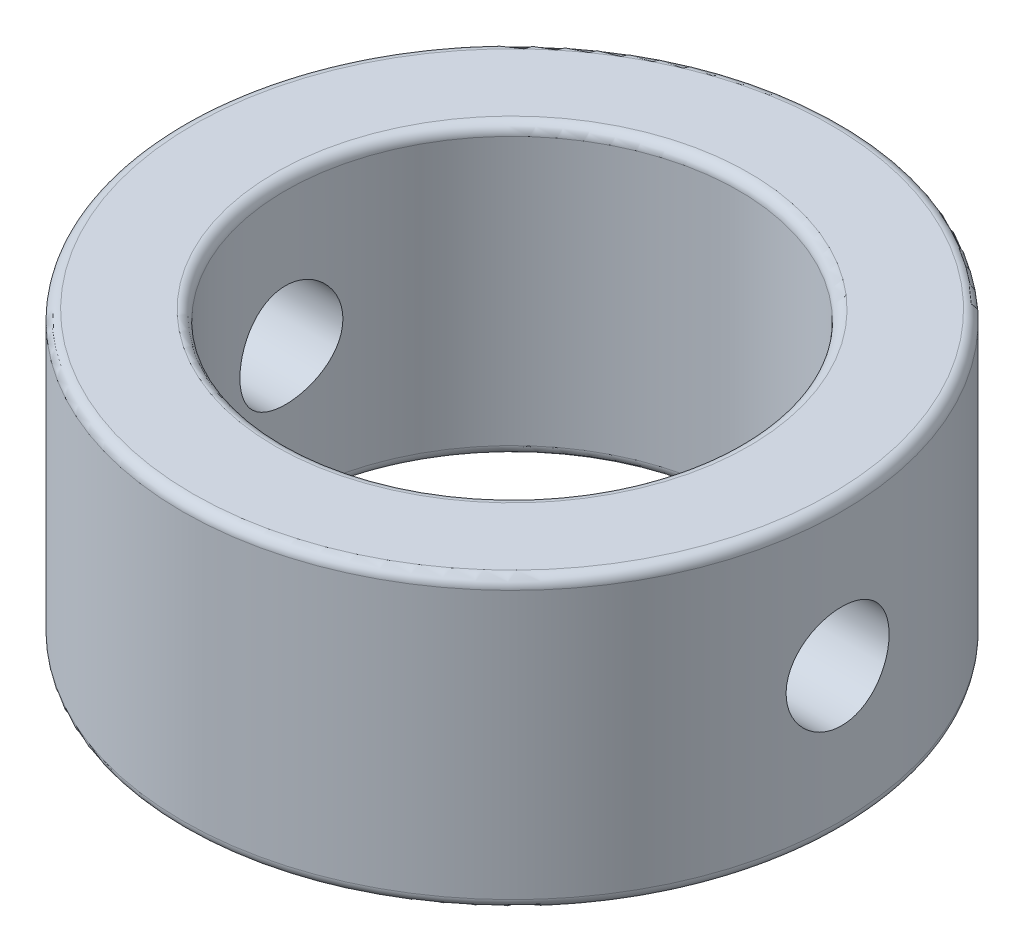
ISO-10303-21;
HEADER;
FILE_DESCRIPTION(('STEP AP214'),'2;1');
FILE_NAME('part.step','',(''),(''),'','','');
FILE_SCHEMA(('AUTOMOTIVE_DESIGN { 1 0 10303 214 1 1 1 1 }'));
ENDSEC;
DATA;
#1=APPLICATION_CONTEXT('core data for automotive mechanical design processes');
#2=APPLICATION_PROTOCOL_DEFINITION('international standard','automotive_design',2000,#1);
#3=PRODUCT_CONTEXT('',#1,'mechanical');
#4=PRODUCT('Part','Part','',(#3));
#5=PRODUCT_RELATED_PRODUCT_CATEGORY('part','',(#4));
#6=PRODUCT_DEFINITION_FORMATION('','',#4);
#7=PRODUCT_DEFINITION_CONTEXT('part definition',#1,'design');
#8=PRODUCT_DEFINITION('design','',#6,#7);
#9=PRODUCT_DEFINITION_SHAPE('','',#8);
#10=(LENGTH_UNIT() NAMED_UNIT(*) SI_UNIT(.MILLI.,.METRE.));
#11=(NAMED_UNIT(*) PLANE_ANGLE_UNIT() SI_UNIT($,.RADIAN.));
#12=(NAMED_UNIT(*) SI_UNIT($,.STERADIAN.) SOLID_ANGLE_UNIT());
#13=UNCERTAINTY_MEASURE_WITH_UNIT(LENGTH_MEASURE(1.E-05),#10,'distance_accuracy_value','');
#14=(GEOMETRIC_REPRESENTATION_CONTEXT(3) GLOBAL_UNCERTAINTY_ASSIGNED_CONTEXT((#13)) GLOBAL_UNIT_ASSIGNED_CONTEXT((#10,
#11,#12)) REPRESENTATION_CONTEXT('',''));
#15=CARTESIAN_POINT('',(0.,0.,0.));
#16=DIRECTION('',(0.,0.,1.));
#17=DIRECTION('',(1.,0.,0.));
#18=AXIS2_PLACEMENT_3D('',#15,#16,#17);
#19=CARTESIAN_POINT('',(0.,7.,0.));
#20=DIRECTION('',(0.,1.,0.));
#21=DIRECTION('',(0.,0.,1.));
#22=AXIS2_PLACEMENT_3D('',#19,#20,#21);
#23=PLANE('',#22);
#24=CARTESIAN_POINT('',(0.,7.,0.));
#25=DIRECTION('',(0.,1.,0.));
#26=DIRECTION('',(0.,0.,1.));
#27=AXIS2_PLACEMENT_3D('',#24,#25,#26);
#28=CIRCLE('',#27,11.5);
#29=CARTESIAN_POINT('',(0.,7.,11.5));
#30=VERTEX_POINT('',#29);
#31=EDGE_CURVE('E10',#30,#30,#28,.F.);
#32=ORIENTED_EDGE('',*,*,#31,.T.);
#33=EDGE_LOOP('',(#32));
#34=FACE_BOUND('',#33,.T.);
#35=CARTESIAN_POINT('',(0.,7.,0.));
#36=DIRECTION('',(0.,1.,0.));
#37=DIRECTION('',(0.,0.,1.));
#38=AXIS2_PLACEMENT_3D('',#35,#36,#37);
#39=CIRCLE('',#38,15.5);
#40=CARTESIAN_POINT('',(0.,7.,15.5));
#41=VERTEX_POINT('',#40);
#42=EDGE_CURVE('E44',#41,#41,#39,.T.);
#43=ORIENTED_EDGE('',*,*,#42,.T.);
#44=EDGE_LOOP('',(#43));
#45=FACE_BOUND('',#44,.T.);
#46=ADVANCED_FACE('F37',(#34,#45),#23,.T.);
#47=CARTESIAN_POINT('',(0.,-7.,0.));
#48=DIRECTION('',(0.,1.,0.));
#49=DIRECTION('',(0.,0.,1.));
#50=AXIS2_PLACEMENT_3D('',#47,#48,#49);
#51=PLANE('',#50);
#52=CARTESIAN_POINT('',(0.,-7.,0.));
#53=DIRECTION('',(0.,1.,0.));
#54=DIRECTION('',(0.,0.,1.));
#55=AXIS2_PLACEMENT_3D('',#52,#53,#54);
#56=CIRCLE('',#55,11.5);
#57=CARTESIAN_POINT('',(0.,-7.,11.5));
#58=VERTEX_POINT('',#57);
#59=EDGE_CURVE('E63',#58,#58,#56,.T.);
#60=ORIENTED_EDGE('',*,*,#59,.T.);
#61=EDGE_LOOP('',(#60));
#62=FACE_BOUND('',#61,.T.);
#63=CARTESIAN_POINT('',(0.,-7.,0.));
#64=DIRECTION('',(0.,1.,0.));
#65=DIRECTION('',(0.,0.,1.));
#66=AXIS2_PLACEMENT_3D('',#63,#64,#65);
#67=CIRCLE('',#66,15.5);
#68=CARTESIAN_POINT('',(0.,-7.,15.5));
#69=VERTEX_POINT('',#68);
#70=EDGE_CURVE('E66',#69,#69,#67,.F.);
#71=ORIENTED_EDGE('',*,*,#70,.T.);
#72=EDGE_LOOP('',(#71));
#73=FACE_BOUND('',#72,.T.);
#74=ADVANCED_FACE('F110',(#62,#73),#51,.F.);
#75=CARTESIAN_POINT('',(0.,7.,0.));
#76=DIRECTION('',(0.,-1.,0.));
#77=DIRECTION('',(0.,0.,-1.));
#78=AXIS2_PLACEMENT_3D('',#75,#76,#77);
#79=CYLINDRICAL_SURFACE('',#78,16.);
#80=CARTESIAN_POINT('',(0.,-6.5,0.));
#81=DIRECTION('',(0.,1.,0.));
#82=DIRECTION('',(0.,0.,1.));
#83=AXIS2_PLACEMENT_3D('',#80,#81,#82);
#84=CIRCLE('',#83,16.);
#85=CARTESIAN_POINT('',(0.,-6.5,16.));
#86=VERTEX_POINT('',#85);
#87=EDGE_CURVE('E48',#86,#86,#84,.T.);
#88=ORIENTED_EDGE('',*,*,#87,.T.);
#89=EDGE_LOOP('',(#88));
#90=FACE_BOUND('',#89,.T.);
#91=CARTESIAN_POINT('',(0.,6.5,0.));
#92=DIRECTION('',(0.,1.,0.));
#93=DIRECTION('',(0.,0.,1.));
#94=AXIS2_PLACEMENT_3D('',#91,#92,#93);
#95=CIRCLE('',#94,16.);
#96=CARTESIAN_POINT('',(0.,6.5,16.));
#97=VERTEX_POINT('',#96);
#98=EDGE_CURVE('E52',#97,#97,#95,.F.);
#99=ORIENTED_EDGE('',*,*,#98,.T.);
#100=EDGE_LOOP('',(#99));
#101=FACE_BOUND('',#100,.T.);
#102=CARTESIAN_POINT('',(-16.,-2.5,0.));
#103=CARTESIAN_POINT('',(-15.9999977019448,-2.49999430172848,-0.139515097271033));
#104=CARTESIAN_POINT('',(-15.9981561248574,-2.48828188622644,-0.279109404865704));
#105=CARTESIAN_POINT('',(-15.9909869809759,-2.44175630872324,-0.554391314978102));
#106=CARTESIAN_POINT('',(-15.9856560884472,-2.40692110749649,-0.690075061323317));
#107=CARTESIAN_POINT('',(-15.9721069716578,-2.31522033719338,-0.953512538047404));
#108=CARTESIAN_POINT('',(-15.9638909956317,-2.2583719186384,-1.0812723522899));
#109=CARTESIAN_POINT('',(-15.9454779403815,-2.12430145485839,-1.3254212510446));
#110=CARTESIAN_POINT('',(-15.9352811186255,-2.04708205696406,-1.44181181036831));
#111=CARTESIAN_POINT('',(-15.9139426841436,-1.87376695164604,-1.66091991165162));
#112=CARTESIAN_POINT('',(-15.9027945139234,-1.77753300510975,-1.76352747914264));
#113=CARTESIAN_POINT('',(-15.8808607613029,-1.56921805173111,-1.95120768822823));
#114=CARTESIAN_POINT('',(-15.8700752005075,-1.4571361026998,-2.03627928654192));
#115=CARTESIAN_POINT('',(-15.8500242812745,-1.21956172865627,-2.18690544328884));
#116=CARTESIAN_POINT('',(-15.840767397861,-1.09400051763821,-2.25235273557992));
#117=CARTESIAN_POINT('',(-15.8249120174236,-0.833498589142195,-2.36118681597065));
#118=CARTESIAN_POINT('',(-15.8183133630222,-0.69855842748944,-2.40457491010063));
#119=CARTESIAN_POINT('',(-15.8085863451104,-0.424289098856214,-2.46771559322167));
#120=CARTESIAN_POINT('',(-15.8054302653236,-0.285004414181201,-2.48765705487496));
#121=CARTESIAN_POINT('',(-15.8028617107177,-0.00503281110735576,-2.50392369757621));
#122=CARTESIAN_POINT('',(-15.8034490028802,0.13565401946604,-2.50025034860466));
#123=CARTESIAN_POINT('',(-15.8082755045521,0.413097031852685,-2.4695458080889));
#124=CARTESIAN_POINT('',(-15.8124817218495,0.549877223353148,-2.44272562959693));
#125=CARTESIAN_POINT('',(-15.8240205634547,0.816972006359324,-2.36681937833751));
#126=CARTESIAN_POINT('',(-15.8313532830641,0.947286400640537,-2.31773262684132));
#127=CARTESIAN_POINT('',(-15.8483550685462,1.19838871267716,-2.19846916949384));
#128=CARTESIAN_POINT('',(-15.8580339308724,1.31913379177307,-2.12820372315549));
#129=CARTESIAN_POINT('',(-15.878630461501,1.54719953568554,-1.96864058146637));
#130=CARTESIAN_POINT('',(-15.8895482178821,1.65451924488747,-1.87934153253016));
#131=CARTESIAN_POINT('',(-15.911537862489,1.85391024663331,-1.68309088822333));
#132=CARTESIAN_POINT('',(-15.9226101363559,1.94580315826946,-1.57595800560539));
#133=CARTESIAN_POINT('',(-15.9435512534783,2.1103331456399,-1.34769694737936));
#134=CARTESIAN_POINT('',(-15.9534200906202,2.18297012355683,-1.22656870068132));
#135=CARTESIAN_POINT('',(-15.9708539902704,2.30693807342239,-0.973595927056491));
#136=CARTESIAN_POINT('',(-15.9784174854193,2.358254558533,-0.84174418624046));
#137=CARTESIAN_POINT('',(-15.9903756000068,2.43796596744723,-0.571149534696759));
#138=CARTESIAN_POINT('',(-15.9947704520898,2.46636257406648,-0.4324071306872));
#139=CARTESIAN_POINT('',(-15.9998651172728,2.49918927645019,-0.153508336763735));
#140=CARTESIAN_POINT('',(-16.0006027179286,2.50386447897618,-0.0133814615087019));
#141=CARTESIAN_POINT('',(-15.9984028649127,2.48976729466402,0.265654546411642));
#142=CARTESIAN_POINT('',(-15.9954655349964,2.47099569741089,0.404563719925156));
#143=CARTESIAN_POINT('',(-15.9862692369322,2.41074161231982,0.676473446265705));
#144=CARTESIAN_POINT('',(-15.9800278421539,2.36937924173227,0.809501262056042));
#145=CARTESIAN_POINT('',(-15.9649207568356,2.26524490560121,1.06673406785663));
#146=CARTESIAN_POINT('',(-15.9560549341007,2.20247186155733,1.19093861303941));
#147=CARTESIAN_POINT('',(-15.9365897274094,2.05672800887342,1.42807220225041));
#148=CARTESIAN_POINT('',(-15.9259772866342,1.97360257990952,1.54090512378372));
#149=CARTESIAN_POINT('',(-15.9042388046444,1.78972791409221,1.75110696507806));
#150=CARTESIAN_POINT('',(-15.8931127309268,1.68897756079515,1.84847490447018));
#151=CARTESIAN_POINT('',(-15.8714802753665,1.47161880278279,2.02588080776691));
#152=CARTESIAN_POINT('',(-15.860980411908,1.35487515287767,2.10575398584126));
#153=CARTESIAN_POINT('',(-15.8419069280583,1.10948392633867,2.2447556772664));
#154=CARTESIAN_POINT('',(-15.83333325222,0.980836692510525,2.30388478778105));
#155=CARTESIAN_POINT('',(-15.8191307135236,0.71577035928581,2.39946771944995));
#156=CARTESIAN_POINT('',(-15.8134908234896,0.579382531234378,2.43600654947912));
#157=CARTESIAN_POINT('',(-15.8057657028079,0.30231085633602,2.48564122040535));
#158=CARTESIAN_POINT('',(-15.8036802038444,0.161627334580993,2.49873883084997));
#159=CARTESIAN_POINT('',(-15.8033105804488,-0.118398715907475,2.50107452690756));
#160=CARTESIAN_POINT('',(-15.804985160429,-0.257739096933502,2.49057180548425));
#161=CARTESIAN_POINT('',(-15.8118569894183,-0.532645297144285,2.44656223255901));
#162=CARTESIAN_POINT('',(-15.8170542307995,-0.668211124501715,2.41305543086961));
#163=CARTESIAN_POINT('',(-15.8303708885491,-0.931637826640519,2.32408329891852));
#164=CARTESIAN_POINT('',(-15.8384876895341,-1.05950547825841,2.26863761738581));
#165=CARTESIAN_POINT('',(-15.856731840474,-1.30416561367627,2.13738768546417));
#166=CARTESIAN_POINT('',(-15.8668592701083,-1.42095765828843,2.06158262820886));
#167=CARTESIAN_POINT('',(-15.8881156809226,-1.64146554412683,1.8908300813908));
#168=CARTESIAN_POINT('',(-15.8992540116029,-1.74503219661384,1.79569107094768));
#169=CARTESIAN_POINT('',(-15.9212004364073,-1.93482123638673,1.58937594638204));
#170=CARTESIAN_POINT('',(-15.9320084534012,-2.02103959859188,1.47819612078432));
#171=CARTESIAN_POINT('',(-15.952151024567,-2.17415122303156,1.24216685884341));
#172=CARTESIAN_POINT('',(-15.9614763443027,-2.24092537275961,1.11723937214238));
#173=CARTESIAN_POINT('',(-15.9775125983888,-2.35244099619295,0.857851882357784));
#174=CARTESIAN_POINT('',(-15.9842262014212,-2.39720497255839,0.723401776581762));
#175=CARTESIAN_POINT('',(-15.9927744586488,-2.45343302109059,0.490314239911593));
#176=CARTESIAN_POINT('',(-15.9954699162612,-2.470868490629,0.393105575651624));
#177=CARTESIAN_POINT('',(-15.9990834869762,-2.49415391337908,0.197277797850582));
#178=CARTESIAN_POINT('',(-16.0000016250796,-2.50000402955734,0.0986587041691184));
#179=CARTESIAN_POINT('',(-16.,-2.5,0.));
#180=B_SPLINE_CURVE_WITH_KNOTS('',3,(#102,#103,#104,#105,#106,#107,#108,#109,#110,#111,#112,
#113,#114,#115,#116,#117,#118,#119,#120,#121,#122,#123,#124,#125,#126,#127,#128,#129,#130,#131,
#132,#133,#134,#135,#136,#137,#138,#139,#140,#141,#142,#143,#144,#145,#146,#147,#148,#149,#150,
#151,#152,#153,#154,#155,#156,#157,#158,#159,#160,#161,#162,#163,#164,#165,#166,#167,#168,#169,
#170,#171,#172,#173,#174,#175,#176,#177,#178,#179),.UNSPECIFIED.,.T.,.F.,(4,2,2,2,2,2,2,2,2,2,2,
2,2,2,2,2,2,2,2,2,2,2,2,2,2,2,2,2,2,2,2,2,2,2,2,2,2,2,4),(0.,0.418184740477491,
0.836768642528014,1.25502707944103,1.6732311879203,2.09459568152199,2.51598523645422,
2.93963778605759,3.36326525009238,3.78345631134995,4.20362121670545,4.6199957602258,
5.0363829965105,5.45453977402347,5.87272629892068,6.29545732334367,6.71819049513827,
7.14121043754565,7.56419931829866,7.98280854005914,8.40140366528356,8.81779444756567,
9.23420620742031,9.65388541469671,10.0735912160142,10.4970948024959,10.9205861964898,
11.3424741039513,11.764330162293,12.1815758159869,12.598820566189,13.0156924696662,
13.4325808967135,13.8538201231554,14.275156971423,14.6990230419984,15.1224548565628,
15.4181801635154,15.7139013105871),.UNSPECIFIED.);
#181=CARTESIAN_POINT('',(-16.,-2.5,0.));
#182=VERTEX_POINT('',#181);
#183=EDGE_CURVE('E69',#182,#182,#180,.T.);
#184=ORIENTED_EDGE('',*,*,#183,.T.);
#185=EDGE_LOOP('',(#184));
#186=FACE_BOUND('',#185,.T.);
#187=CARTESIAN_POINT('',(15.8034806292791,0.,-2.5));
#188=CARTESIAN_POINT('',(15.8034830346332,-0.139503378340977,-2.49999429179104));
#189=CARTESIAN_POINT('',(15.8053478026579,-0.279085997685314,-2.48828377742084));
#190=CARTESIAN_POINT('',(15.8125997089632,-0.554343629002854,-2.44176643645043));
#191=CARTESIAN_POINT('',(15.8179902148259,-0.690014775479362,-2.40693752801736));
#192=CARTESIAN_POINT('',(15.8316684916183,-0.953425589644386,-2.31525516047132));
#193=CARTESIAN_POINT('',(15.8399539668268,-1.08117144787076,-2.25841914921921));
#194=CARTESIAN_POINT('',(15.8584858981599,-1.32529689084211,-2.12437791816389));
#195=CARTESIAN_POINT('',(15.8687321022282,-1.44167793365954,-2.04717531605122));
#196=CARTESIAN_POINT('',(15.8901303851737,-1.66079648515127,-1.8738773011091));
#197=CARTESIAN_POINT('',(15.9012888784461,-1.76342107439964,-1.77763988617499));
#198=CARTESIAN_POINT('',(15.9231973082665,-1.95113422042993,-1.56931080987671));
#199=CARTESIAN_POINT('',(15.9339472216983,-2.03622178622429,-1.45721825316848));
#200=CARTESIAN_POINT('',(15.9538946715316,-2.18686487704115,-1.21963429185761));
#201=CARTESIAN_POINT('',(15.9630838016344,-2.25231600397446,-1.09407592635729));
#202=CARTESIAN_POINT('',(15.978803149105,-2.36115795472508,-0.833580171794755));
#203=CARTESIAN_POINT('',(15.9853335186778,-2.40455004138267,-0.698643320136809));
#204=CARTESIAN_POINT('',(15.9949542857973,-2.46769871895616,-0.42438532544881));
#205=CARTESIAN_POINT('',(15.9980722260505,-2.48764464906835,-0.28510876016075));
#206=CARTESIAN_POINT('',(16.0006113098095,-2.50392304330337,-0.00515314355066946));
#207=CARTESIAN_POINT('',(16.0000326754547,-2.50025692635184,0.135525822989188));
#208=CARTESIAN_POINT('',(15.9952657389868,-2.46956407372214,0.413000089722152));
#209=CARTESIAN_POINT('',(15.9911089169598,-2.44274106115968,0.549818542575175));
#210=CARTESIAN_POINT('',(15.9796877395528,-2.36681597137738,0.816988375343492));
#211=CARTESIAN_POINT('',(15.9724232987387,-2.31771328164586,0.947339577352176));
#212=CARTESIAN_POINT('',(15.9555491842028,-2.19841634413995,1.19848742679247));
#213=CARTESIAN_POINT('',(15.9459300777042,-2.12813699457205,1.31924299071837));
#214=CARTESIAN_POINT('',(15.9254174702046,-1.96854391937076,1.54732385653213));
#215=CARTESIAN_POINT('',(15.9145238783282,-1.87922883604501,1.65464819959324));
#216=CARTESIAN_POINT('',(15.8925387825556,-1.68296651292673,1.85402198520023));
#217=CARTESIAN_POINT('',(15.8814464071021,-1.57584133360514,1.94589625613075));
#218=CARTESIAN_POINT('',(15.8604269384475,-1.34760243531787,2.11039226047485));
#219=CARTESIAN_POINT('',(15.8504998536298,-1.22648861572594,2.18301385538335));
#220=CARTESIAN_POINT('',(15.8329349281613,-0.973520371894197,2.30697060635685));
#221=CARTESIAN_POINT('',(15.8252991458489,-0.841656424926548,2.35828663884161));
#222=CARTESIAN_POINT('',(15.8132168990948,-0.57103515129452,2.43799343127668));
#223=CARTESIAN_POINT('',(15.8087701897074,-0.432278354930278,2.46638595195258));
#224=CARTESIAN_POINT('',(15.8036163696886,-0.153371896724788,2.49919719237856));
#225=CARTESIAN_POINT('',(15.80287044806,-0.0132521998052415,2.50386473411271));
#226=CARTESIAN_POINT('',(15.8050994977182,0.265767635297906,2.48975479033184));
#227=CARTESIAN_POINT('',(15.8080743433524,0.404667814505862,2.47097809654328));
#228=CARTESIAN_POINT('',(15.8173740105186,0.676527807466474,2.41072412555895));
#229=CARTESIAN_POINT('',(15.8236803883335,0.8095159986396,2.36937178781979));
#230=CARTESIAN_POINT('',(15.8389172439685,1.06667397110389,2.26527072241932));
#231=CARTESIAN_POINT('',(15.8478478614411,1.19084328264902,2.20252085602949));
#232=CARTESIAN_POINT('',(15.8674179220711,1.42795128164882,2.05681199170293));
#233=CARTESIAN_POINT('',(15.8780706945976,1.54079022889997,1.97369251093471));
#234=CARTESIAN_POINT('',(15.8998450469621,1.75100698084821,1.78982593995283));
#235=CARTESIAN_POINT('',(15.9109666556111,1.84838383360704,1.6890777652142));
#236=CARTESIAN_POINT('',(15.9325473887455,2.02581127063547,1.47171546765808));
#237=CARTESIAN_POINT('',(15.9429995842164,2.10569657643007,1.35496564158984));
#238=CARTESIAN_POINT('',(15.9619548934084,2.24471951999023,1.10955861029337));
#239=CARTESIAN_POINT('',(15.9704580640831,2.30385776404594,0.98090175316249));
#240=CARTESIAN_POINT('',(15.9845269767683,2.39944627528415,0.715839663778324));
#241=CARTESIAN_POINT('',(15.9901042225572,2.43598549743941,0.579467147617086));
#242=CARTESIAN_POINT('',(15.9977412978946,2.48562613267281,0.302427949770743));
#243=CARTESIAN_POINT('',(15.9998013804089,2.49872923135596,0.161761577654428));
#244=CARTESIAN_POINT('',(16.0001691012796,2.50108185265522,-0.118272165188273));
#245=CARTESIAN_POINT('',(15.9985164403994,2.49058374464276,-0.257637428859788));
#246=CARTESIAN_POINT('',(15.9917247801431,2.44657468381965,-0.532594595464885));
#247=CARTESIAN_POINT('',(15.9865857947973,2.41306382362158,-0.668186513581644));
#248=CARTESIAN_POINT('',(15.9733964142131,2.32407274028764,-0.931668850429403));
#249=CARTESIAN_POINT('',(15.965348528289,2.26861144841907,-1.05956579651625));
#250=CARTESIAN_POINT('',(15.947223323121,2.13732116147798,-1.30427807253219));
#251=CARTESIAN_POINT('',(15.9371459268214,2.06149139302579,-1.42109298145458));
#252=CARTESIAN_POINT('',(15.9159528222148,1.89071055679162,-1.64160219185804));
#253=CARTESIAN_POINT('',(15.9048276353277,1.79557368569597,-1.745151694824));
#254=CARTESIAN_POINT('',(15.8828612878644,1.5892700426646,-1.93490712736948));
#255=CARTESIAN_POINT('',(15.8720201944801,1.4780995182753,-2.02110898563013));
#256=CARTESIAN_POINT('',(15.8517779742959,1.24207889572461,-2.17420151541622));
#257=CARTESIAN_POINT('',(15.842386091806,1.11714904139029,-2.24097044145097));
#258=CARTESIAN_POINT('',(15.8262143333515,0.857756782369972,-2.35247565604314));
#259=CARTESIAN_POINT('',(15.8194317848938,0.723304298883418,-2.3972345005847));
#260=CARTESIAN_POINT('',(15.8107909670081,0.490230260303602,-2.45344906957713));
#261=CARTESIAN_POINT('',(15.8080643798014,0.393038400015115,-2.47087849275467));
#262=CARTESIAN_POINT('',(15.804408373768,0.19724421895363,-2.49415589078729));
#263=CARTESIAN_POINT('',(15.8034789284691,0.0986419189782413,-2.50000403623692));
#264=CARTESIAN_POINT('',(15.8034806292791,0.,-2.5));
#265=B_SPLINE_CURVE_WITH_KNOTS('',3,(#187,#188,#189,#190,#191,#192,#193,#194,#195,#196,#197,
#198,#199,#200,#201,#202,#203,#204,#205,#206,#207,#208,#209,#210,#211,#212,#213,#214,#215,#216,
#217,#218,#219,#220,#221,#222,#223,#224,#225,#226,#227,#228,#229,#230,#231,#232,#233,#234,#235,
#236,#237,#238,#239,#240,#241,#242,#243,#244,#245,#246,#247,#248,#249,#250,#251,#252,#253,#254,
#255,#256,#257,#258,#259,#260,#261,#262,#263,#264),.UNSPECIFIED.,.T.,.F.,(4,2,2,2,2,2,2,2,2,2,2,
2,2,2,2,2,2,2,2,2,2,2,2,2,2,2,2,2,2,2,2,2,2,2,2,2,2,2,4),(0.,0.418149527902241,
0.836699032574078,1.25491737645053,1.67308199345223,2.09449258051085,2.51592697424482,
2.93956378022295,3.36317633102573,3.78334397517517,4.20348637030326,4.61996979150785,
5.03646466334576,5.45465612930833,5.87287743207563,6.29556043395287,6.71824647655855,
7.14131110038651,7.56434322607052,7.98292940034458,8.40150143908464,8.81778013452042,
9.23408098683358,9.65377352836981,10.0734918986585,10.4970197199928,10.9205351635679,
11.3423727623224,11.7641800198745,12.18149834073,12.5988149821383,13.0157724881518,
13.432745828047,13.8539404040181,14.275233715164,14.6991122166338,15.1225554163993,
15.4182305458031,15.7139013198206),.UNSPECIFIED.);
#266=CARTESIAN_POINT('',(15.8034806292791,0.,-2.5));
#267=VERTEX_POINT('',#266);
#268=EDGE_CURVE('E78',#267,#267,#265,.T.);
#269=ORIENTED_EDGE('',*,*,#268,.T.);
#270=EDGE_LOOP('',(#269));
#271=FACE_BOUND('',#270,.T.);
#272=ADVANCED_FACE('F105',(#90,#101,#186,#271),#79,.T.);
#273=CARTESIAN_POINT('',(0.,7.,0.));
#274=DIRECTION('',(0.,-1.,0.));
#275=DIRECTION('',(0.,0.,-1.));
#276=AXIS2_PLACEMENT_3D('',#273,#274,#275);
#277=CYLINDRICAL_SURFACE('',#276,11.);
#278=CARTESIAN_POINT('',(0.,-6.5,0.));
#279=DIRECTION('',(0.,1.,0.));
#280=DIRECTION('',(0.,0.,1.));
#281=AXIS2_PLACEMENT_3D('',#278,#279,#280);
#282=CIRCLE('',#281,11.);
#283=CARTESIAN_POINT('',(0.,-6.5,11.));
#284=VERTEX_POINT('',#283);
#285=EDGE_CURVE('E57',#284,#284,#282,.F.);
#286=ORIENTED_EDGE('',*,*,#285,.T.);
#287=EDGE_LOOP('',(#286));
#288=FACE_BOUND('',#287,.T.);
#289=CARTESIAN_POINT('',(0.,6.5,0.));
#290=DIRECTION('',(0.,1.,0.));
#291=DIRECTION('',(0.,0.,1.));
#292=AXIS2_PLACEMENT_3D('',#289,#290,#291);
#293=CIRCLE('',#292,11.);
#294=CARTESIAN_POINT('',(0.,6.5,11.));
#295=VERTEX_POINT('',#294);
#296=EDGE_CURVE('E60',#295,#295,#293,.T.);
#297=ORIENTED_EDGE('',*,*,#296,.T.);
#298=EDGE_LOOP('',(#297));
#299=FACE_BOUND('',#298,.T.);
#300=CARTESIAN_POINT('',(-10.7121426428143,0.,-2.5));
#301=CARTESIAN_POINT('',(-10.7121454314233,0.138466190954528,-2.49999543238962));
#302=CARTESIAN_POINT('',(-10.7148566472694,0.276986082337185,-2.48845712333954));
#303=CARTESIAN_POINT('',(-10.7253866484904,0.550076575056332,-2.44266520236751));
#304=CARTESIAN_POINT('',(-10.7332089369474,0.684644401534488,-2.40839601066357));
#305=CARTESIAN_POINT('',(-10.7530304465066,0.945841058373466,-2.31828540377217));
#306=CARTESIAN_POINT('',(-10.7650248735991,1.07247880458495,-2.26246873972878));
#307=CARTESIAN_POINT('',(-10.7918333757398,1.31459839968131,-2.13091974990438));
#308=CARTESIAN_POINT('',(-10.8066474399211,1.43008029155815,-2.05518750087741));
#309=CARTESIAN_POINT('',(-10.8377278041731,1.6487154808709,-1.88448528035886));
#310=CARTESIAN_POINT('',(-10.8540139214629,1.75163578041055,-1.78922044020224));
#311=CARTESIAN_POINT('',(-10.8860302886159,1.94018250510919,-1.58279346057436));
#312=CARTESIAN_POINT('',(-10.9017604930117,2.02580751839435,-1.4716300245101));
#313=CARTESIAN_POINT('',(-10.93110941005,2.17826304827206,-1.23499021284435));
#314=CARTESIAN_POINT('',(-10.9447020098483,2.24486820043069,-1.10936512825883));
#315=CARTESIAN_POINT('',(-10.9680197641523,2.35593341841309,-0.848343855636441));
#316=CARTESIAN_POINT('',(-10.9777453878714,2.40039617113036,-0.712948855424522));
#317=CARTESIAN_POINT('',(-10.992093320832,2.4651780957488,-0.438655593897397));
#318=CARTESIAN_POINT('',(-10.9967989680676,2.48589197735748,-0.299854987503796));
#319=CARTESIAN_POINT('',(-11.0008659279287,2.5038235330812,-0.020674459041042));
#320=CARTESIAN_POINT('',(-11.0002278985982,2.50104410026593,0.119705266442305));
#321=CARTESIAN_POINT('',(-10.9937426547597,2.47235927142653,0.395333870912044));
#322=CARTESIAN_POINT('',(-10.9879913110538,2.44687947198624,0.53062963162453));
#323=CARTESIAN_POINT('',(-10.972035500945,2.37419692034856,0.79497303115836));
#324=CARTESIAN_POINT('',(-10.9618308229987,2.32699313620665,0.924020372842029));
#325=CARTESIAN_POINT('',(-10.9379627182996,2.21183459013289,1.17336944375684));
#326=CARTESIAN_POINT('',(-10.9242729764965,2.14372109926423,1.29359524399307));
#327=CARTESIAN_POINT('',(-10.8949317146097,1.9887954880441,1.52106399956616));
#328=CARTESIAN_POINT('',(-10.8792799076932,1.90198063241803,1.62830505215689));
#329=CARTESIAN_POINT('',(-10.8473171066438,1.7098085843367,1.82929354427355));
#330=CARTESIAN_POINT('',(-10.8309992019581,1.60407898919961,1.92268414978479));
#331=CARTESIAN_POINT('',(-10.7998704044976,1.37828918426258,2.09047920073133));
#332=CARTESIAN_POINT('',(-10.7850595594488,1.25822852088493,2.16488304500243));
#333=CARTESIAN_POINT('',(-10.7586016791364,1.00657601189026,2.29276887377835));
#334=CARTESIAN_POINT('',(-10.7469656031437,0.874946246080213,2.3461786596901));
#335=CARTESIAN_POINT('',(-10.7283231226734,0.604251446260694,2.43000958929392));
#336=CARTESIAN_POINT('',(-10.7213159185924,0.465187700904694,2.46043470354816));
#337=CARTESIAN_POINT('',(-10.7128889420635,0.186845752338147,2.49686920193376));
#338=CARTESIAN_POINT('',(-10.7113498101725,0.0476393671862809,2.50340025202094));
#339=CARTESIAN_POINT('',(-10.7137104989267,-0.229873208145282,2.49327772715816));
#340=CARTESIAN_POINT('',(-10.7176099135701,-0.368179464747589,2.47662588287242));
#341=CARTESIAN_POINT('',(-10.7302951733771,-0.638118293808385,2.42106417661717));
#342=CARTESIAN_POINT('',(-10.7390169712549,-0.769814166805822,2.38244586746638));
#343=CARTESIAN_POINT('',(-10.7603057031402,-1.02486559243074,2.28436509536444));
#344=CARTESIAN_POINT('',(-10.7728730289421,-1.14822029366921,2.22490050843923));
#345=CARTESIAN_POINT('',(-10.8006961734274,-1.38533303903934,2.08568096094998));
#346=CARTESIAN_POINT('',(-10.8159929667106,-1.49889893904089,2.00560710889276));
#347=CARTESIAN_POINT('',(-10.847445444588,-1.71117330324603,1.82785558175614));
#348=CARTESIAN_POINT('',(-10.8636012445728,-1.80987976451868,1.73017553739798));
#349=CARTESIAN_POINT('',(-10.8953477425749,-1.99168109801582,1.51761489811829));
#350=CARTESIAN_POINT('',(-10.9109203453324,-2.07441892472078,1.40242575322726));
#351=CARTESIAN_POINT('',(-10.9394030007809,-2.21937081430504,1.159481676287));
#352=CARTESIAN_POINT('',(-10.9523131827213,-2.28158587356556,1.03172735466866));
#353=CARTESIAN_POINT('',(-10.9739405859898,-2.38324041107997,0.768105049315912));
#354=CARTESIAN_POINT('',(-10.9826854368624,-2.42283032739891,0.632297446270902));
#355=CARTESIAN_POINT('',(-10.9951167589318,-2.47857654735429,0.355736283082478));
#356=CARTESIAN_POINT('',(-10.9988040274401,-2.4947365446643,0.214983506118725));
#357=CARTESIAN_POINT('',(-11.0006787302882,-2.50298711617191,-0.0640926427285478));
#358=CARTESIAN_POINT('',(-10.9989875888252,-2.49560907850598,-0.202399752438726));
#359=CARTESIAN_POINT('',(-10.9905580161125,-2.45818905132186,-0.475747789729383));
#360=CARTESIAN_POINT('',(-10.9838196900264,-2.42814753402196,-0.610788785302399));
#361=CARTESIAN_POINT('',(-10.96606448264,-2.3465163607887,-0.873322034218739));
#362=CARTESIAN_POINT('',(-10.9550636655368,-2.29500755489862,-1.00084058283969));
#363=CARTESIAN_POINT('',(-10.9299536917879,-2.17198077313979,-1.24549315867952));
#364=CARTESIAN_POINT('',(-10.9158442081789,-2.10046069231224,-1.36262609174177));
#365=CARTESIAN_POINT('',(-10.8856935133435,-1.93773803535717,-1.58575630284182));
#366=CARTESIAN_POINT('',(-10.8696188788032,-1.84616508560281,-1.69147898146279));
#367=CARTESIAN_POINT('',(-10.8375213996161,-1.64667602970222,-1.88623829979112));
#368=CARTESIAN_POINT('',(-10.8214985685478,-1.53875594541497,-1.97527086605942));
#369=CARTESIAN_POINT('',(-10.7910549272231,-1.30772800618311,-2.13539007203787));
#370=CARTESIAN_POINT('',(-10.7766611159887,-1.18442028714458,-2.2061937971019));
#371=CARTESIAN_POINT('',(-10.7514502387736,-0.927351148743043,-2.32596037579883));
#372=CARTESIAN_POINT('',(-10.7406302556445,-0.793598366019797,-2.37494105401434));
#373=CARTESIAN_POINT('',(-10.72571344068,-0.549832042529961,-2.44129910462464));
#374=CARTESIAN_POINT('',(-10.7206593017667,-0.441103827426284,-2.46326828297558));
#375=CARTESIAN_POINT('',(-10.7138728814852,-0.221595128190536,-2.49262014337059));
#376=CARTESIAN_POINT('',(-10.712140411085,-0.110814761206151,-2.50000365546745));
#377=CARTESIAN_POINT('',(-10.7121426428143,0.,-2.5));
#378=B_SPLINE_CURVE_WITH_KNOTS('',3,(#300,#301,#302,#303,#304,#305,#306,#307,#308,#309,#310,
#311,#312,#313,#314,#315,#316,#317,#318,#319,#320,#321,#322,#323,#324,#325,#326,#327,#328,#329,
#330,#331,#332,#333,#334,#335,#336,#337,#338,#339,#340,#341,#342,#343,#344,#345,#346,#347,#348,
#349,#350,#351,#352,#353,#354,#355,#356,#357,#358,#359,#360,#361,#362,#363,#364,#365,#366,#367,
#368,#369,#370,#371,#372,#373,#374,#375,#376,#377),.UNSPECIFIED.,.T.,.F.,(4,2,2,2,2,2,2,2,2,2,2,
2,2,2,2,2,2,2,2,2,2,2,2,2,2,2,2,2,2,2,2,2,2,2,2,2,2,2,4),(0.,0.414992243301631,
0.830269217244779,1.2450705835768,1.65987035130107,2.08146637272044,2.5030967965796,
2.92953338750108,3.35591821939512,3.77510878183784,4.1942477240696,4.60569006667321,
5.01715195585207,5.43181796836808,5.84654467145158,6.27057865094874,6.69462605466424,
7.12011925968861,7.54553894468119,7.96161330230364,8.37765660054311,8.78830262277903,
9.19899049685668,9.6164612095842,10.0339881436657,10.4599792598124,10.8859496910277,
11.3090538013157,11.7320912029453,12.1456463784943,12.5591929374091,12.9711958750873,
13.3832421670976,13.8036601623803,14.2241806329332,14.6508801056332,15.0772304178392,
15.4093684172414,15.7414875145232),.UNSPECIFIED.);
#379=CARTESIAN_POINT('',(-10.7121426428143,0.,-2.5));
#380=VERTEX_POINT('',#379);
#381=EDGE_CURVE('E70',#380,#380,#378,.T.);
#382=ORIENTED_EDGE('',*,*,#381,.F.);
#383=EDGE_LOOP('',(#382));
#384=FACE_BOUND('',#383,.T.);
#385=CARTESIAN_POINT('',(10.7121426428143,0.,-2.5));
#386=CARTESIAN_POINT('',(10.7121454314233,-0.138466190954528,-2.49999543238962));
#387=CARTESIAN_POINT('',(10.7148566472694,-0.276986082337185,-2.48845712333954));
#388=CARTESIAN_POINT('',(10.7253866484904,-0.550076575056332,-2.44266520236751));
#389=CARTESIAN_POINT('',(10.7332089369474,-0.684644401534488,-2.40839601066357));
#390=CARTESIAN_POINT('',(10.7530304465066,-0.945841058373466,-2.31828540377217));
#391=CARTESIAN_POINT('',(10.7650248735991,-1.07247880458495,-2.26246873972878));
#392=CARTESIAN_POINT('',(10.7918333757398,-1.31459839968131,-2.13091974990438));
#393=CARTESIAN_POINT('',(10.8066474399211,-1.43008029155815,-2.05518750087741));
#394=CARTESIAN_POINT('',(10.8377278041731,-1.6487154808709,-1.88448528035886));
#395=CARTESIAN_POINT('',(10.8540139214629,-1.75163578041055,-1.78922044020224));
#396=CARTESIAN_POINT('',(10.8860302886159,-1.94018250510919,-1.58279346057436));
#397=CARTESIAN_POINT('',(10.9017604930117,-2.02580751839435,-1.4716300245101));
#398=CARTESIAN_POINT('',(10.93110941005,-2.17826304827206,-1.23499021284435));
#399=CARTESIAN_POINT('',(10.9447020098483,-2.24486820043069,-1.10936512825883));
#400=CARTESIAN_POINT('',(10.9680197641523,-2.35593341841309,-0.848343855636441));
#401=CARTESIAN_POINT('',(10.9777453878714,-2.40039617113036,-0.712948855424522));
#402=CARTESIAN_POINT('',(10.992093320832,-2.4651780957488,-0.438655593897397));
#403=CARTESIAN_POINT('',(10.9967989680676,-2.48589197735748,-0.299854987503796));
#404=CARTESIAN_POINT('',(11.0008659279287,-2.5038235330812,-0.020674459041042));
#405=CARTESIAN_POINT('',(11.0002278985982,-2.50104410026593,0.119705266442305));
#406=CARTESIAN_POINT('',(10.9937426547597,-2.47235927142653,0.395333870912044));
#407=CARTESIAN_POINT('',(10.9879913110538,-2.44687947198624,0.53062963162453));
#408=CARTESIAN_POINT('',(10.972035500945,-2.37419692034856,0.79497303115836));
#409=CARTESIAN_POINT('',(10.9618308229987,-2.32699313620665,0.924020372842029));
#410=CARTESIAN_POINT('',(10.9379627182996,-2.21183459013289,1.17336944375684));
#411=CARTESIAN_POINT('',(10.9242729764965,-2.14372109926423,1.29359524399307));
#412=CARTESIAN_POINT('',(10.8949317146097,-1.9887954880441,1.52106399956616));
#413=CARTESIAN_POINT('',(10.8792799076932,-1.90198063241803,1.62830505215689));
#414=CARTESIAN_POINT('',(10.8473171066438,-1.7098085843367,1.82929354427355));
#415=CARTESIAN_POINT('',(10.8309992019581,-1.60407898919961,1.92268414978479));
#416=CARTESIAN_POINT('',(10.7998704044976,-1.37828918426258,2.09047920073133));
#417=CARTESIAN_POINT('',(10.7850595594488,-1.25822852088493,2.16488304500243));
#418=CARTESIAN_POINT('',(10.7586016791364,-1.00657601189026,2.29276887377835));
#419=CARTESIAN_POINT('',(10.7469656031437,-0.874946246080213,2.3461786596901));
#420=CARTESIAN_POINT('',(10.7283231226734,-0.604251446260694,2.43000958929392));
#421=CARTESIAN_POINT('',(10.7213159185924,-0.465187700904694,2.46043470354816));
#422=CARTESIAN_POINT('',(10.7128889420635,-0.186845752338147,2.49686920193376));
#423=CARTESIAN_POINT('',(10.7113498101725,-0.0476393671862809,2.50340025202094));
#424=CARTESIAN_POINT('',(10.7137104989267,0.229873208145282,2.49327772715816));
#425=CARTESIAN_POINT('',(10.7176099135701,0.368179464747589,2.47662588287242));
#426=CARTESIAN_POINT('',(10.7302951733771,0.638118293808385,2.42106417661717));
#427=CARTESIAN_POINT('',(10.7390169712549,0.769814166805822,2.38244586746638));
#428=CARTESIAN_POINT('',(10.7603057031402,1.02486559243074,2.28436509536444));
#429=CARTESIAN_POINT('',(10.7728730289421,1.14822029366921,2.22490050843923));
#430=CARTESIAN_POINT('',(10.8006961734274,1.38533303903934,2.08568096094998));
#431=CARTESIAN_POINT('',(10.8159929667106,1.49889893904089,2.00560710889276));
#432=CARTESIAN_POINT('',(10.847445444588,1.71117330324603,1.82785558175614));
#433=CARTESIAN_POINT('',(10.8636012445728,1.80987976451868,1.73017553739798));
#434=CARTESIAN_POINT('',(10.8953477425749,1.99168109801582,1.51761489811829));
#435=CARTESIAN_POINT('',(10.9109203453324,2.07441892472078,1.40242575322726));
#436=CARTESIAN_POINT('',(10.9394030007809,2.21937081430504,1.159481676287));
#437=CARTESIAN_POINT('',(10.9523131827213,2.28158587356556,1.03172735466866));
#438=CARTESIAN_POINT('',(10.9739405859898,2.38324041107997,0.768105049315912));
#439=CARTESIAN_POINT('',(10.9826854368624,2.42283032739891,0.632297446270902));
#440=CARTESIAN_POINT('',(10.9951167589318,2.47857654735429,0.355736283082478));
#441=CARTESIAN_POINT('',(10.9988040274401,2.4947365446643,0.214983506118725));
#442=CARTESIAN_POINT('',(11.0006787302882,2.50298711617191,-0.0640926427285478));
#443=CARTESIAN_POINT('',(10.9989875888252,2.49560907850598,-0.202399752438726));
#444=CARTESIAN_POINT('',(10.9905580161125,2.45818905132186,-0.475747789729383));
#445=CARTESIAN_POINT('',(10.9838196900264,2.42814753402196,-0.610788785302399));
#446=CARTESIAN_POINT('',(10.96606448264,2.3465163607887,-0.873322034218739));
#447=CARTESIAN_POINT('',(10.9550636655368,2.29500755489862,-1.00084058283969));
#448=CARTESIAN_POINT('',(10.9299536917879,2.17198077313979,-1.24549315867952));
#449=CARTESIAN_POINT('',(10.9158442081789,2.10046069231224,-1.36262609174177));
#450=CARTESIAN_POINT('',(10.8856935133435,1.93773803535717,-1.58575630284182));
#451=CARTESIAN_POINT('',(10.8696188788032,1.84616508560281,-1.69147898146279));
#452=CARTESIAN_POINT('',(10.8375213996161,1.64667602970222,-1.88623829979112));
#453=CARTESIAN_POINT('',(10.8214985685478,1.53875594541497,-1.97527086605942));
#454=CARTESIAN_POINT('',(10.7910549272231,1.30772800618311,-2.13539007203787));
#455=CARTESIAN_POINT('',(10.7766611159887,1.18442028714458,-2.2061937971019));
#456=CARTESIAN_POINT('',(10.7514502387736,0.927351148743043,-2.32596037579883));
#457=CARTESIAN_POINT('',(10.7406302556445,0.793598366019797,-2.37494105401434));
#458=CARTESIAN_POINT('',(10.72571344068,0.549832042529961,-2.44129910462464));
#459=CARTESIAN_POINT('',(10.7206593017667,0.441103827426284,-2.46326828297558));
#460=CARTESIAN_POINT('',(10.7138728814852,0.221595128190536,-2.49262014337059));
#461=CARTESIAN_POINT('',(10.712140411085,0.110814761206151,-2.50000365546745));
#462=CARTESIAN_POINT('',(10.7121426428143,0.,-2.5));
#463=B_SPLINE_CURVE_WITH_KNOTS('',3,(#385,#386,#387,#388,#389,#390,#391,#392,#393,#394,#395,
#396,#397,#398,#399,#400,#401,#402,#403,#404,#405,#406,#407,#408,#409,#410,#411,#412,#413,#414,
#415,#416,#417,#418,#419,#420,#421,#422,#423,#424,#425,#426,#427,#428,#429,#430,#431,#432,#433,
#434,#435,#436,#437,#438,#439,#440,#441,#442,#443,#444,#445,#446,#447,#448,#449,#450,#451,#452,
#453,#454,#455,#456,#457,#458,#459,#460,#461,#462),.UNSPECIFIED.,.T.,.F.,(4,2,2,2,2,2,2,2,2,2,2,
2,2,2,2,2,2,2,2,2,2,2,2,2,2,2,2,2,2,2,2,2,2,2,2,2,2,2,4),(0.,0.414992243301631,
0.830269217244779,1.2450705835768,1.65987035130107,2.08146637272044,2.5030967965796,
2.92953338750108,3.35591821939512,3.77510878183784,4.1942477240696,4.60569006667321,
5.01715195585207,5.43181796836808,5.84654467145158,6.27057865094874,6.69462605466424,
7.12011925968861,7.54553894468119,7.96161330230364,8.37765660054311,8.78830262277903,
9.19899049685668,9.6164612095842,10.0339881436657,10.4599792598124,10.8859496910277,
11.3090538013157,11.7320912029453,12.1456463784943,12.5591929374091,12.9711958750873,
13.3832421670976,13.8036601623803,14.2241806329332,14.6508801056332,15.0772304178392,
15.4093684172414,15.7414875145232),.UNSPECIFIED.);
#464=CARTESIAN_POINT('',(10.7121426428143,0.,-2.5));
#465=VERTEX_POINT('',#464);
#466=EDGE_CURVE('E79',#465,#465,#463,.T.);
#467=ORIENTED_EDGE('',*,*,#466,.F.);
#468=EDGE_LOOP('',(#467));
#469=FACE_BOUND('',#468,.T.);
#470=ADVANCED_FACE('F84',(#288,#299,#384,#469),#277,.F.);
#471=CARTESIAN_POINT('',(-16.,0.,0.));
#472=DIRECTION('',(1.,0.,0.));
#473=DIRECTION('',(0.,0.,-1.));
#474=AXIS2_PLACEMENT_3D('',#471,#472,#473);
#475=CYLINDRICAL_SURFACE('',#474,2.5);
#476=ORIENTED_EDGE('',*,*,#466,.T.);
#477=EDGE_LOOP('',(#476));
#478=FACE_BOUND('',#477,.T.);
#479=ORIENTED_EDGE('',*,*,#268,.F.);
#480=EDGE_LOOP('',(#479));
#481=FACE_BOUND('',#480,.T.);
#482=ADVANCED_FACE('F91',(#478,#481),#475,.F.);
#483=ORIENTED_EDGE('',*,*,#381,.T.);
#484=EDGE_LOOP('',(#483));
#485=FACE_BOUND('',#484,.T.);
#486=ORIENTED_EDGE('',*,*,#183,.F.);
#487=EDGE_LOOP('',(#486));
#488=FACE_BOUND('',#487,.T.);
#489=ADVANCED_FACE('F87',(#485,#488),#475,.F.);
#490=CARTESIAN_POINT('',(0.,-6.5,0.));
#491=DIRECTION('',(0.,1.,0.));
#492=DIRECTION('',(0.,0.,1.));
#493=AXIS2_PLACEMENT_3D('',#490,#491,#492);
#494=TOROIDAL_SURFACE('',#493,11.5,0.5);
#495=ORIENTED_EDGE('',*,*,#285,.F.);
#496=EDGE_LOOP('',(#495));
#497=FACE_BOUND('',#496,.T.);
#498=ORIENTED_EDGE('',*,*,#59,.F.);
#499=EDGE_LOOP('',(#498));
#500=FACE_BOUND('',#499,.T.);
#501=ADVANCED_FACE('F90',(#497,#500),#494,.T.);
#502=CARTESIAN_POINT('',(0.,-6.5,0.));
#503=DIRECTION('',(0.,1.,0.));
#504=DIRECTION('',(0.,0.,1.));
#505=AXIS2_PLACEMENT_3D('',#502,#503,#504);
#506=TOROIDAL_SURFACE('',#505,15.5,0.5);
#507=ORIENTED_EDGE('',*,*,#70,.F.);
#508=EDGE_LOOP('',(#507));
#509=FACE_BOUND('',#508,.T.);
#510=ORIENTED_EDGE('',*,*,#87,.F.);
#511=EDGE_LOOP('',(#510));
#512=FACE_BOUND('',#511,.T.);
#513=ADVANCED_FACE('F115',(#509,#512),#506,.T.);
#514=CARTESIAN_POINT('',(0.,6.5,0.));
#515=DIRECTION('',(0.,1.,0.));
#516=DIRECTION('',(0.,0.,1.));
#517=AXIS2_PLACEMENT_3D('',#514,#515,#516);
#518=TOROIDAL_SURFACE('',#517,11.5,0.5);
#519=ORIENTED_EDGE('',*,*,#31,.F.);
#520=EDGE_LOOP('',(#519));
#521=FACE_BOUND('',#520,.T.);
#522=ORIENTED_EDGE('',*,*,#296,.F.);
#523=EDGE_LOOP('',(#522));
#524=FACE_BOUND('',#523,.T.);
#525=ADVANCED_FACE('F118',(#521,#524),#518,.T.);
#526=CARTESIAN_POINT('',(0.,6.5,0.));
#527=DIRECTION('',(0.,1.,0.));
#528=DIRECTION('',(0.,0.,1.));
#529=AXIS2_PLACEMENT_3D('',#526,#527,#528);
#530=TOROIDAL_SURFACE('',#529,15.5,0.5);
#531=ORIENTED_EDGE('',*,*,#98,.F.);
#532=EDGE_LOOP('',(#531));
#533=FACE_BOUND('',#532,.T.);
#534=ORIENTED_EDGE('',*,*,#42,.F.);
#535=EDGE_LOOP('',(#534));
#536=FACE_BOUND('',#535,.T.);
#537=ADVANCED_FACE('F39',(#533,#536),#530,.T.);
#538=CLOSED_SHELL('',(#46,#74,#272,#470,#482,#489,#501,#513,#525,#537));
#539=MANIFOLD_SOLID_BREP('B2',#538);
#540=ADVANCED_BREP_SHAPE_REPRESENTATION('',(#18,#539),#14);
#541=SHAPE_DEFINITION_REPRESENTATION(#9,#540);
ENDSEC;
END-ISO-10303-21;
